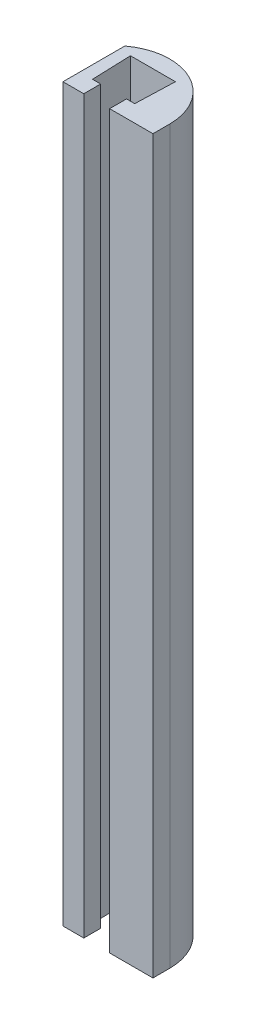
ISO-10303-21;
HEADER;
FILE_DESCRIPTION(('STEP AP214'),'2;1');
FILE_NAME('part.step','',(''),(''),'','','');
FILE_SCHEMA(('AUTOMOTIVE_DESIGN { 1 0 10303 214 1 1 1 1 }'));
ENDSEC;
DATA;
#1=APPLICATION_CONTEXT('core data for automotive mechanical design processes');
#2=APPLICATION_PROTOCOL_DEFINITION('international standard','automotive_design',2000,#1);
#3=PRODUCT_CONTEXT('',#1,'mechanical');
#4=PRODUCT('Part','Part','',(#3));
#5=PRODUCT_RELATED_PRODUCT_CATEGORY('part','',(#4));
#6=PRODUCT_DEFINITION_FORMATION('','',#4);
#7=PRODUCT_DEFINITION_CONTEXT('part definition',#1,'design');
#8=PRODUCT_DEFINITION('design','',#6,#7);
#9=PRODUCT_DEFINITION_SHAPE('','',#8);
#10=(LENGTH_UNIT() NAMED_UNIT(*) SI_UNIT(.MILLI.,.METRE.));
#11=(NAMED_UNIT(*) PLANE_ANGLE_UNIT() SI_UNIT($,.RADIAN.));
#12=(NAMED_UNIT(*) SI_UNIT($,.STERADIAN.) SOLID_ANGLE_UNIT());
#13=UNCERTAINTY_MEASURE_WITH_UNIT(LENGTH_MEASURE(1.E-05),#10,'distance_accuracy_value','');
#14=(GEOMETRIC_REPRESENTATION_CONTEXT(3) GLOBAL_UNCERTAINTY_ASSIGNED_CONTEXT((#13)) GLOBAL_UNIT_ASSIGNED_CONTEXT((#10,
#11,#12)) REPRESENTATION_CONTEXT('',''));
#15=CARTESIAN_POINT('',(0.,0.,0.));
#16=DIRECTION('',(0.,0.,1.));
#17=DIRECTION('',(1.,0.,0.));
#18=AXIS2_PLACEMENT_3D('',#15,#16,#17);
#19=CARTESIAN_POINT('',(0.,130.,-3.));
#20=DIRECTION('',(0.,-1.,0.));
#21=DIRECTION('',(0.,0.,-1.));
#22=AXIS2_PLACEMENT_3D('',#19,#20,#21);
#23=CYLINDRICAL_SURFACE('',#22,10.);
#24=CARTESIAN_POINT('',(0.,0.,-3.));
#25=DIRECTION('',(0.,1.,0.));
#26=DIRECTION('',(0.,0.,-1.));
#27=AXIS2_PLACEMENT_3D('',#24,#25,#26);
#28=CIRCLE('',#27,10.);
#29=CARTESIAN_POINT('',(10.,0.,-3.));
#30=VERTEX_POINT('',#29);
#31=CARTESIAN_POINT('',(-6.,0.,-11.));
#32=VERTEX_POINT('',#31);
#33=EDGE_CURVE('E163',#30,#32,#28,.T.);
#34=ORIENTED_EDGE('',*,*,#33,.T.);
#35=DIRECTION('',(0.,-1.,0.));
#36=VECTOR('',#35,1.);
#37=CARTESIAN_POINT('',(-6.,130.,-11.));
#38=LINE('',#37,#36);
#39=CARTESIAN_POINT('',(-6.,130.,-11.));
#40=VERTEX_POINT('',#39);
#41=EDGE_CURVE('E197',#40,#32,#38,.T.);
#42=ORIENTED_EDGE('',*,*,#41,.F.);
#43=CARTESIAN_POINT('',(0.,130.,-3.));
#44=DIRECTION('',(0.,1.,0.));
#45=DIRECTION('',(0.,0.,1.));
#46=AXIS2_PLACEMENT_3D('',#43,#44,#45);
#47=CIRCLE('',#46,10.);
#48=CARTESIAN_POINT('',(10.,130.,-3.));
#49=VERTEX_POINT('',#48);
#50=EDGE_CURVE('E226',#49,#40,#47,.T.);
#51=ORIENTED_EDGE('',*,*,#50,.F.);
#52=DIRECTION('',(0.,-1.,0.));
#53=VECTOR('',#52,1.);
#54=CARTESIAN_POINT('',(10.,130.,-3.));
#55=LINE('',#54,#53);
#56=EDGE_CURVE('E200',#49,#30,#55,.T.);
#57=ORIENTED_EDGE('',*,*,#56,.T.);
#58=EDGE_LOOP('',(#34,#42,#51,#57));
#59=FACE_BOUND('',#58,.T.);
#60=CARTESIAN_POINT('',(0.,10.25,-13.));
#61=CARTESIAN_POINT('',(-0.101518396192305,10.2499995931478,-13.0000003148877));
#62=CARTESIAN_POINT('',(-0.203030435693203,10.2541257705902,-12.9984506611724));
#63=CARTESIAN_POINT('',(-0.405326586162715,10.2705881656394,-12.9922947410159));
#64=CARTESIAN_POINT('',(-0.506110453997933,10.2829270079811,-12.9876874973824));
#65=CARTESIAN_POINT('',(-0.706124419877822,10.315688890499,-12.9755408643138));
#66=CARTESIAN_POINT('',(-0.805355315325653,10.3361076301856,-12.9680030347074));
#67=CARTESIAN_POINT('',(-1.00162576283666,10.3848251633169,-12.9502001825416));
#68=CARTESIAN_POINT('',(-1.09866444757431,10.4131270185872,-12.939934100392));
#69=CARTESIAN_POINT('',(-1.38503029440588,10.5093564477781,-12.9054755824967));
#70=CARTESIAN_POINT('',(-1.5702179144485,10.588709300538,-12.8775833893482));
#71=CARTESIAN_POINT('',(-1.92453093012071,10.7752730259327,-12.8147179131779));
#72=CARTESIAN_POINT('',(-2.09365200095869,10.8824913705457,-12.7797427314478));
#73=CARTESIAN_POINT('',(-2.41835679874341,11.1265293479933,-12.7046565368922));
#74=CARTESIAN_POINT('',(-2.5731743450747,11.2643251244624,-12.6644001618842));
#75=CARTESIAN_POINT('',(-2.85811301792009,11.5635266179955,-12.5840054244584));
#76=CARTESIAN_POINT('',(-2.98822658522002,11.7249395350443,-12.5438671018508));
#77=CARTESIAN_POINT('',(-3.22495435340075,12.0742935184669,-12.4665617929786));
#78=CARTESIAN_POINT('',(-3.3304846420933,12.2630108761455,-12.4295662278791));
#79=CARTESIAN_POINT('',(-3.50796634607769,12.6571209256243,-12.3649964985801));
#80=CARTESIAN_POINT('',(-3.57993117334566,12.8625069184467,-12.3374185724932));
#81=CARTESIAN_POINT('',(-3.68521072814697,13.2752918405197,-12.2963603224291));
#82=CARTESIAN_POINT('',(-3.71998981781697,13.4822625933885,-12.2823481091592));
#83=CARTESIAN_POINT('',(-3.75448892593294,13.8995403976836,-12.2684515361422));
#84=CARTESIAN_POINT('',(-3.75422342336961,14.1098460353624,-12.2685613417545));
#85=CARTESIAN_POINT('',(-3.71976073714327,14.5144238124091,-12.2824377905461));
#86=CARTESIAN_POINT('',(-3.68759521184218,14.7089022650539,-12.2953867204446));
#87=CARTESIAN_POINT('',(-3.59360419748527,15.0894678763057,-12.3321234500933));
#88=CARTESIAN_POINT('',(-3.5317742417939,15.2755537666093,-12.3559128820936));
#89=CARTESIAN_POINT('',(-3.37909371408551,15.6381926692342,-12.4121425551398));
#90=CARTESIAN_POINT('',(-3.28771621837055,15.8144987152801,-12.4447379498071));
#91=CARTESIAN_POINT('',(-3.07890184412442,16.1498643440006,-12.51485525338));
#92=CARTESIAN_POINT('',(-2.96145596823814,16.3089179438057,-12.5523788614005));
#93=CARTESIAN_POINT('',(-2.69454451914693,16.6165091591204,-12.6312009715082));
#94=CARTESIAN_POINT('',(-2.54345746791939,16.7636216018684,-12.6725836863999));
#95=CARTESIAN_POINT('',(-2.21828147705205,17.0308449155163,-12.752293204094));
#96=CARTESIAN_POINT('',(-2.04418900874462,17.1509516365147,-12.7906195366466));
#97=CARTESIAN_POINT('',(-1.67430859247982,17.3623259926558,-12.8606598702292));
#98=CARTESIAN_POINT('',(-1.47822678461148,17.4531189530525,-12.892262456491));
#99=CARTESIAN_POINT('',(-1.07209212631178,17.5999565106752,-12.9444679581735));
#100=CARTESIAN_POINT('',(-0.862045527114481,17.6560165414028,-12.9650757585372));
#101=CARTESIAN_POINT('',(-0.445938107871603,17.7290569688548,-12.9921110807018));
#102=CARTESIAN_POINT('',(-0.240259048905582,17.7479565159562,-12.9992342256422));
#103=CARTESIAN_POINT('',(0.171431188137619,17.7517276597498,-13.0006473425031));
#104=CARTESIAN_POINT('',(0.377442282458727,17.7366068007921,-12.9949401596715));
#105=CARTESIAN_POINT('',(0.775655121404365,17.6742248942282,-12.9717927443161));
#106=CARTESIAN_POINT('',(0.968083320017282,17.6282211406568,-12.9548117740578));
#107=CARTESIAN_POINT('',(1.34235438739411,17.5070348186322,-12.9112869272928));
#108=CARTESIAN_POINT('',(1.52419587587278,17.4318484551318,-12.8847418070502));
#109=CARTESIAN_POINT('',(1.87811941277132,17.2520339688993,-12.8237406101926));
#110=CARTESIAN_POINT('',(2.04975770887911,17.1466056769341,-12.7890750052357));
#111=CARTESIAN_POINT('',(2.37348177933194,16.9102047420785,-12.7156667891146));
#112=CARTESIAN_POINT('',(2.52556030073359,16.7792226686649,-12.6769226752304));
#113=CARTESIAN_POINT('',(2.81507699680056,16.4864896946599,-12.5968332372827));
#114=CARTESIAN_POINT('',(2.95115385285618,16.3233945429555,-12.5554674126238));
#115=CARTESIAN_POINT('',(3.19427625103064,15.9758715383436,-12.4769703936408));
#116=CARTESIAN_POINT('',(3.30131918623443,15.7914417719504,-12.4398395797458));
#117=CARTESIAN_POINT('',(3.48344433709986,15.4049600326458,-12.3741707456762));
#118=CARTESIAN_POINT('',(3.55839213290037,15.2028381336405,-12.345669008641));
#119=CARTESIAN_POINT('',(3.67269708994278,14.7874755923629,-12.3013508218467));
#120=CARTESIAN_POINT('',(3.71207626984255,14.5742419154097,-12.2855265248386));
#121=CARTESIAN_POINT('',(3.75215866602556,14.1574595956214,-12.2693973713104));
#122=CARTESIAN_POINT('',(3.75518324604508,13.9541684007001,-12.2681611185003));
#123=CARTESIAN_POINT('',(3.72841793238675,13.5501367293154,-12.278960313216));
#124=CARTESIAN_POINT('',(3.69863115021474,13.3493960128158,-12.2909945023041));
#125=CARTESIAN_POINT('',(3.60889524149326,12.9623818609874,-12.3262035591886));
#126=CARTESIAN_POINT('',(3.54989440883459,12.7758538687135,-12.3490272063437));
#127=CARTESIAN_POINT('',(3.40424296871538,12.4152364945042,-12.4030386355008));
#128=CARTESIAN_POINT('',(3.31758537143274,12.2411502706625,-12.4342285316256));
#129=CARTESIAN_POINT('',(3.11379974329922,11.9004319829787,-12.5034933799157));
#130=CARTESIAN_POINT('',(2.99531258181789,11.7346690218977,-12.5418435402028));
#131=CARTESIAN_POINT('',(2.73337038412728,11.4246500849433,-12.6201550894072));
#132=CARTESIAN_POINT('',(2.58990741255809,11.2804009716157,-12.6601169872989));
#133=CARTESIAN_POINT('',(2.27266851234862,11.009479395099,-12.7397648699462));
#134=CARTESIAN_POINT('',(2.0976723337802,10.884180484779,-12.7793189022729));
#135=CARTESIAN_POINT('',(1.82043095326466,10.7197353821215,-12.8333601549829));
#136=CARTESIAN_POINT('',(1.7254952234331,10.6688130456688,-12.8505013475998));
#137=CARTESIAN_POINT('',(1.5312993669715,10.5752052334941,-12.8825493292825));
#138=CARTESIAN_POINT('',(1.43204109937803,10.5325162588267,-12.8974570668994));
#139=CARTESIAN_POINT('',(1.22544652708578,10.4540835375359,-12.92520117632));
#140=CARTESIAN_POINT('',(1.11794690479036,10.4187272364551,-12.9379177964972));
#141=CARTESIAN_POINT('',(0.899916442865954,10.3578229288076,-12.9600275124024));
#142=CARTESIAN_POINT('',(0.789386953961826,10.3322706253938,-12.9694220639682));
#143=CARTESIAN_POINT('',(0.56624360569349,10.2912623484285,-12.9845816899313));
#144=CARTESIAN_POINT('',(0.453630117900994,10.2758045925444,-12.9903474050436));
#145=CARTESIAN_POINT('',(0.22734168292238,10.2551742261257,-12.9980561682157));
#146=CARTESIAN_POINT('',(0.113666856910657,10.2500004555392,-12.9999996474305));
#147=CARTESIAN_POINT('',(0.,10.25,-13.));
#148=B_SPLINE_CURVE_WITH_KNOTS('',3,(#60,#61,#62,#63,#64,#65,#66,#67,#68,#69,#70,#71,#72,#73,
#74,#75,#76,#77,#78,#79,#80,#81,#82,#83,#84,#85,#86,#87,#88,#89,#90,#91,#92,#93,#94,#95,#96,#97,
#98,#99,#100,#101,#102,#103,#104,#105,#106,#107,#108,#109,#110,#111,#112,#113,#114,#115,#116,
#117,#118,#119,#120,#121,#122,#123,#124,#125,#126,#127,#128,#129,#130,#131,#132,#133,#134,#135,
#136,#137,#138,#139,#140,#141,#142,#143,#144,#145,#146,#147),.UNSPECIFIED.,.T.,.F.,(4,2,2,2,2,2,
2,2,2,2,2,2,2,2,2,2,2,2,2,2,2,2,2,2,2,2,2,2,2,2,2,2,2,2,2,2,2,2,2,2,2,2,2,4),(0.,
0.304448353706217,0.60899405463877,0.913377880020562,1.21788009423816,1.82504714344594,
2.43237716943574,3.0629591849799,3.69373384355255,4.34853558295347,5.00307545421535,
5.63076558083454,6.25819637240469,6.8480773484487,7.43804717199766,8.03917893015839,
8.6405184890894,9.28227255387826,9.92412516810958,10.5759031026348,11.2273912129541,
11.8442442113811,12.4609604302459,13.0539796685789,13.6470760518443,14.2575992669729,
14.8683482209796,15.5145317068744,16.1607731934865,16.809695388663,17.4582155943956,
18.0650878074892,18.6719024757644,19.2601972811463,19.8486408868956,20.4679305175897,
21.0874172704095,21.7404269618339,22.0673415343729,22.3941168698762,22.7352461802417,
23.0762258109096,23.4171452206013,23.7580261717922),.UNSPECIFIED.);
#149=CARTESIAN_POINT('',(0.,10.25,-13.));
#150=VERTEX_POINT('',#149);
#151=EDGE_CURVE('E158',#150,#150,#148,.T.);
#152=ORIENTED_EDGE('',*,*,#151,.F.);
#153=EDGE_LOOP('',(#152));
#154=FACE_BOUND('',#153,.T.);
#155=ADVANCED_FACE('F34',(#59,#154),#23,.T.);
#156=CARTESIAN_POINT('',(2.3,130.,-3.));
#157=DIRECTION('',(1.,0.,0.));
#158=DIRECTION('',(0.,0.,-1.));
#159=AXIS2_PLACEMENT_3D('',#156,#157,#158);
#160=PLANE('',#159);
#161=DIRECTION('',(0.,0.,1.));
#162=VECTOR('',#161,1.);
#163=CARTESIAN_POINT('',(2.3,0.,-3.));
#164=LINE('',#163,#162);
#165=CARTESIAN_POINT('',(2.3,0.,-3.));
#166=VERTEX_POINT('',#165);
#167=CARTESIAN_POINT('',(2.3,0.,0.));
#168=VERTEX_POINT('',#167);
#169=EDGE_CURVE('E155',#166,#168,#164,.T.);
#170=ORIENTED_EDGE('',*,*,#169,.T.);
#171=DIRECTION('',(0.,-1.,0.));
#172=VECTOR('',#171,1.);
#173=CARTESIAN_POINT('',(2.3,130.,0.));
#174=LINE('',#173,#172);
#175=CARTESIAN_POINT('',(2.3,130.,0.));
#176=VERTEX_POINT('',#175);
#177=EDGE_CURVE('E11',#176,#168,#174,.T.);
#178=ORIENTED_EDGE('',*,*,#177,.F.);
#179=DIRECTION('',(0.,0.,1.));
#180=VECTOR('',#179,1.);
#181=CARTESIAN_POINT('',(2.3,130.,-3.));
#182=LINE('',#181,#180);
#183=CARTESIAN_POINT('',(2.3,130.,-3.));
#184=VERTEX_POINT('',#183);
#185=EDGE_CURVE('E182',#184,#176,#182,.T.);
#186=ORIENTED_EDGE('',*,*,#185,.F.);
#187=DIRECTION('',(0.,-1.,0.));
#188=VECTOR('',#187,1.);
#189=CARTESIAN_POINT('',(2.3,130.,-3.));
#190=LINE('',#189,#188);
#191=EDGE_CURVE('E98',#184,#166,#190,.T.);
#192=ORIENTED_EDGE('',*,*,#191,.T.);
#193=EDGE_LOOP('',(#170,#178,#186,#192));
#194=FACE_BOUND('',#193,.T.);
#195=ADVANCED_FACE('F36',(#194),#160,.F.);
#196=CARTESIAN_POINT('',(2.3,130.,0.));
#197=DIRECTION('',(0.,0.,-1.));
#198=DIRECTION('',(-1.,0.,0.));
#199=AXIS2_PLACEMENT_3D('',#196,#197,#198);
#200=PLANE('',#199);
#201=DIRECTION('',(1.,0.,0.));
#202=VECTOR('',#201,1.);
#203=CARTESIAN_POINT('',(2.3,0.,0.));
#204=LINE('',#203,#202);
#205=CARTESIAN_POINT('',(10.,0.,0.));
#206=VERTEX_POINT('',#205);
#207=EDGE_CURVE('E157',#168,#206,#204,.T.);
#208=ORIENTED_EDGE('',*,*,#207,.T.);
#209=DIRECTION('',(0.,-1.,0.));
#210=VECTOR('',#209,1.);
#211=CARTESIAN_POINT('',(10.,130.,0.));
#212=LINE('',#211,#210);
#213=CARTESIAN_POINT('',(10.,130.,0.));
#214=VERTEX_POINT('',#213);
#215=EDGE_CURVE('E43',#214,#206,#212,.T.);
#216=ORIENTED_EDGE('',*,*,#215,.F.);
#217=DIRECTION('',(1.,0.,0.));
#218=VECTOR('',#217,1.);
#219=CARTESIAN_POINT('',(2.3,130.,0.));
#220=LINE('',#219,#218);
#221=EDGE_CURVE('E105',#176,#214,#220,.T.);
#222=ORIENTED_EDGE('',*,*,#221,.F.);
#223=ORIENTED_EDGE('',*,*,#177,.T.);
#224=EDGE_LOOP('',(#208,#216,#222,#223));
#225=FACE_BOUND('',#224,.T.);
#226=ADVANCED_FACE('F293',(#225),#200,.F.);
#227=CARTESIAN_POINT('',(10.,130.,0.));
#228=DIRECTION('',(-1.,0.,0.));
#229=DIRECTION('',(0.,0.,1.));
#230=AXIS2_PLACEMENT_3D('',#227,#228,#229);
#231=PLANE('',#230);
#232=DIRECTION('',(0.,0.,-1.));
#233=VECTOR('',#232,1.);
#234=CARTESIAN_POINT('',(10.,0.,0.));
#235=LINE('',#234,#233);
#236=EDGE_CURVE('E160',#206,#30,#235,.T.);
#237=ORIENTED_EDGE('',*,*,#236,.T.);
#238=ORIENTED_EDGE('',*,*,#56,.F.);
#239=DIRECTION('',(0.,0.,-1.));
#240=VECTOR('',#239,1.);
#241=CARTESIAN_POINT('',(10.,130.,0.));
#242=LINE('',#241,#240);
#243=EDGE_CURVE('E209',#214,#49,#242,.T.);
#244=ORIENTED_EDGE('',*,*,#243,.F.);
#245=ORIENTED_EDGE('',*,*,#215,.T.);
#246=EDGE_LOOP('',(#237,#238,#244,#245));
#247=FACE_BOUND('',#246,.T.);
#248=ADVANCED_FACE('F207',(#247),#231,.F.);
#249=CARTESIAN_POINT('',(-6.,130.,0.));
#250=DIRECTION('',(1.,0.,0.));
#251=DIRECTION('',(0.,0.,-1.));
#252=AXIS2_PLACEMENT_3D('',#249,#250,#251);
#253=PLANE('',#252);
#254=DIRECTION('',(0.,0.,1.));
#255=VECTOR('',#254,1.);
#256=CARTESIAN_POINT('',(-6.,0.,0.));
#257=LINE('',#256,#255);
#258=CARTESIAN_POINT('',(-6.,0.,0.));
#259=VERTEX_POINT('',#258);
#260=EDGE_CURVE('E165',#32,#259,#257,.T.);
#261=ORIENTED_EDGE('',*,*,#260,.T.);
#262=DIRECTION('',(0.,-1.,0.));
#263=VECTOR('',#262,1.);
#264=CARTESIAN_POINT('',(-6.,130.,0.));
#265=LINE('',#264,#263);
#266=CARTESIAN_POINT('',(-6.,130.,0.));
#267=VERTEX_POINT('',#266);
#268=EDGE_CURVE('E194',#267,#259,#265,.T.);
#269=ORIENTED_EDGE('',*,*,#268,.F.);
#270=DIRECTION('',(0.,0.,1.));
#271=VECTOR('',#270,1.);
#272=CARTESIAN_POINT('',(-6.,130.,0.));
#273=LINE('',#272,#271);
#274=EDGE_CURVE('E223',#40,#267,#273,.T.);
#275=ORIENTED_EDGE('',*,*,#274,.F.);
#276=ORIENTED_EDGE('',*,*,#41,.T.);
#277=EDGE_LOOP('',(#261,#269,#275,#276));
#278=FACE_BOUND('',#277,.T.);
#279=ADVANCED_FACE('F221',(#278),#253,.F.);
#280=CARTESIAN_POINT('',(-2.3,130.,0.));
#281=DIRECTION('',(0.,0.,-1.));
#282=DIRECTION('',(-1.,0.,0.));
#283=AXIS2_PLACEMENT_3D('',#280,#281,#282);
#284=PLANE('',#283);
#285=DIRECTION('',(1.,0.,0.));
#286=VECTOR('',#285,1.);
#287=CARTESIAN_POINT('',(-2.3,0.,0.));
#288=LINE('',#287,#286);
#289=CARTESIAN_POINT('',(-2.3,0.,0.));
#290=VERTEX_POINT('',#289);
#291=EDGE_CURVE('E167',#259,#290,#288,.T.);
#292=ORIENTED_EDGE('',*,*,#291,.T.);
#293=DIRECTION('',(0.,-1.,0.));
#294=VECTOR('',#293,1.);
#295=CARTESIAN_POINT('',(-2.3,130.,0.));
#296=LINE('',#295,#294);
#297=CARTESIAN_POINT('',(-2.3,130.,0.));
#298=VERTEX_POINT('',#297);
#299=EDGE_CURVE('E191',#298,#290,#296,.T.);
#300=ORIENTED_EDGE('',*,*,#299,.F.);
#301=DIRECTION('',(1.,0.,0.));
#302=VECTOR('',#301,1.);
#303=CARTESIAN_POINT('',(-2.3,130.,0.));
#304=LINE('',#303,#302);
#305=EDGE_CURVE('E225',#267,#298,#304,.T.);
#306=ORIENTED_EDGE('',*,*,#305,.F.);
#307=ORIENTED_EDGE('',*,*,#268,.T.);
#308=EDGE_LOOP('',(#292,#300,#306,#307));
#309=FACE_BOUND('',#308,.T.);
#310=ADVANCED_FACE('F285',(#309),#284,.F.);
#311=CARTESIAN_POINT('',(-2.3,130.,-3.));
#312=DIRECTION('',(-1.,0.,0.));
#313=DIRECTION('',(0.,0.,1.));
#314=AXIS2_PLACEMENT_3D('',#311,#312,#313);
#315=PLANE('',#314);
#316=DIRECTION('',(0.,0.,-1.));
#317=VECTOR('',#316,1.);
#318=CARTESIAN_POINT('',(-2.3,0.,-3.));
#319=LINE('',#318,#317);
#320=CARTESIAN_POINT('',(-2.3,0.,-3.));
#321=VERTEX_POINT('',#320);
#322=EDGE_CURVE('E169',#290,#321,#319,.T.);
#323=ORIENTED_EDGE('',*,*,#322,.T.);
#324=DIRECTION('',(0.,-1.,0.));
#325=VECTOR('',#324,1.);
#326=CARTESIAN_POINT('',(-2.3,130.,-3.));
#327=LINE('',#326,#325);
#328=CARTESIAN_POINT('',(-2.3,130.,-3.));
#329=VERTEX_POINT('',#328);
#330=EDGE_CURVE('E189',#329,#321,#327,.T.);
#331=ORIENTED_EDGE('',*,*,#330,.F.);
#332=DIRECTION('',(0.,0.,-1.));
#333=VECTOR('',#332,1.);
#334=CARTESIAN_POINT('',(-2.3,130.,-3.));
#335=LINE('',#334,#333);
#336=EDGE_CURVE('E228',#298,#329,#335,.T.);
#337=ORIENTED_EDGE('',*,*,#336,.F.);
#338=ORIENTED_EDGE('',*,*,#299,.T.);
#339=EDGE_LOOP('',(#323,#331,#337,#338));
#340=FACE_BOUND('',#339,.T.);
#341=ADVANCED_FACE('F282',(#340),#315,.F.);
#342=CARTESIAN_POINT('',(-3.75,130.,-3.));
#343=DIRECTION('',(0.,0.,1.));
#344=DIRECTION('',(1.,0.,0.));
#345=AXIS2_PLACEMENT_3D('',#342,#343,#344);
#346=PLANE('',#345);
#347=ORIENTED_EDGE('',*,*,#330,.T.);
#348=DIRECTION('',(-1.,0.,0.));
#349=VECTOR('',#348,1.);
#350=CARTESIAN_POINT('',(-3.75,0.,-3.));
#351=LINE('',#350,#349);
#352=CARTESIAN_POINT('',(-3.75,0.,-3.));
#353=VERTEX_POINT('',#352);
#354=EDGE_CURVE('E172',#321,#353,#351,.T.);
#355=ORIENTED_EDGE('',*,*,#354,.T.);
#356=DIRECTION('',(0.,-1.,0.));
#357=VECTOR('',#356,1.);
#358=CARTESIAN_POINT('',(-3.75,130.,-3.));
#359=LINE('',#358,#357);
#360=CARTESIAN_POINT('',(-3.75,130.,-3.));
#361=VERTEX_POINT('',#360);
#362=EDGE_CURVE('E186',#361,#353,#359,.T.);
#363=ORIENTED_EDGE('',*,*,#362,.F.);
#364=DIRECTION('',(-1.,0.,0.));
#365=VECTOR('',#364,1.);
#366=CARTESIAN_POINT('',(-3.75,130.,-3.));
#367=LINE('',#366,#365);
#368=EDGE_CURVE('E234',#329,#361,#367,.T.);
#369=ORIENTED_EDGE('',*,*,#368,.F.);
#370=EDGE_LOOP('',(#347,#355,#363,#369));
#371=FACE_BOUND('',#370,.T.);
#372=ADVANCED_FACE('F240',(#371),#346,.F.);
#373=CARTESIAN_POINT('',(-3.75,130.,-3.));
#374=DIRECTION('',(-0.999362854347549,0.,0.0356915305124125));
#375=DIRECTION('',(0.0356915305124125,0.,0.99936285434755));
#376=AXIS2_PLACEMENT_3D('',#373,#374,#375);
#377=PLANE('',#376);
#378=DIRECTION('',(-0.0356915305124125,0.,-0.999362854347549));
#379=VECTOR('',#378,1.);
#380=CARTESIAN_POINT('',(-3.75,0.,-3.));
#381=LINE('',#380,#379);
#382=CARTESIAN_POINT('',(-4.,0.,-10.));
#383=VERTEX_POINT('',#382);
#384=EDGE_CURVE('E175',#353,#383,#381,.T.);
#385=ORIENTED_EDGE('',*,*,#384,.T.);
#386=DIRECTION('',(0.,-1.,0.));
#387=VECTOR('',#386,1.);
#388=CARTESIAN_POINT('',(-4.,130.,-10.));
#389=LINE('',#388,#387);
#390=CARTESIAN_POINT('',(-4.,130.,-10.));
#391=VERTEX_POINT('',#390);
#392=EDGE_CURVE('E148',#391,#383,#389,.T.);
#393=ORIENTED_EDGE('',*,*,#392,.F.);
#394=DIRECTION('',(-0.0356915305124125,0.,-0.999362854347549));
#395=VECTOR('',#394,1.);
#396=CARTESIAN_POINT('',(-3.75,130.,-3.));
#397=LINE('',#396,#395);
#398=EDGE_CURVE('E136',#361,#391,#397,.T.);
#399=ORIENTED_EDGE('',*,*,#398,.F.);
#400=ORIENTED_EDGE('',*,*,#362,.T.);
#401=EDGE_LOOP('',(#385,#393,#399,#400));
#402=FACE_BOUND('',#401,.T.);
#403=ADVANCED_FACE('F244',(#402),#377,.F.);
#404=CARTESIAN_POINT('',(4.,130.,-10.));
#405=DIRECTION('',(0.,0.,-1.));
#406=DIRECTION('',(-1.,0.,0.));
#407=AXIS2_PLACEMENT_3D('',#404,#405,#406);
#408=PLANE('',#407);
#409=CARTESIAN_POINT('',(0.,14.,-10.));
#410=DIRECTION('',(0.,0.,-1.));
#411=DIRECTION('',(-1.,0.,0.));
#412=AXIS2_PLACEMENT_3D('',#409,#410,#411);
#413=CIRCLE('',#412,3.75);
#414=CARTESIAN_POINT('',(-3.75,14.,-10.));
#415=VERTEX_POINT('',#414);
#416=EDGE_CURVE('E258',#415,#415,#413,.F.);
#417=ORIENTED_EDGE('',*,*,#416,.F.);
#418=EDGE_LOOP('',(#417));
#419=FACE_BOUND('',#418,.T.);
#420=DIRECTION('',(1.,0.,0.));
#421=VECTOR('',#420,1.);
#422=CARTESIAN_POINT('',(4.,0.,-10.));
#423=LINE('',#422,#421);
#424=CARTESIAN_POINT('',(4.,0.,-10.));
#425=VERTEX_POINT('',#424);
#426=EDGE_CURVE('E145',#383,#425,#423,.T.);
#427=ORIENTED_EDGE('',*,*,#426,.T.);
#428=DIRECTION('',(0.,-1.,0.));
#429=VECTOR('',#428,1.);
#430=CARTESIAN_POINT('',(4.,130.,-10.));
#431=LINE('',#430,#429);
#432=CARTESIAN_POINT('',(4.,130.,-10.));
#433=VERTEX_POINT('',#432);
#434=EDGE_CURVE('E142',#433,#425,#431,.T.);
#435=ORIENTED_EDGE('',*,*,#434,.F.);
#436=DIRECTION('',(1.,0.,0.));
#437=VECTOR('',#436,1.);
#438=CARTESIAN_POINT('',(4.,130.,-10.));
#439=LINE('',#438,#437);
#440=EDGE_CURVE('E130',#391,#433,#439,.T.);
#441=ORIENTED_EDGE('',*,*,#440,.F.);
#442=ORIENTED_EDGE('',*,*,#392,.T.);
#443=EDGE_LOOP('',(#427,#435,#441,#442));
#444=FACE_BOUND('',#443,.T.);
#445=ADVANCED_FACE('F143',(#419,#444),#408,.F.);
#446=CARTESIAN_POINT('',(3.75,130.,-3.));
#447=DIRECTION('',(0.999362854347549,0.,0.0356915305124125));
#448=DIRECTION('',(0.0356915305124125,0.,-0.99936285434755));
#449=AXIS2_PLACEMENT_3D('',#446,#447,#448);
#450=PLANE('',#449);
#451=DIRECTION('',(-0.0356915305124125,0.,0.999362854347549));
#452=VECTOR('',#451,1.);
#453=CARTESIAN_POINT('',(3.75,0.,-3.));
#454=LINE('',#453,#452);
#455=CARTESIAN_POINT('',(3.75,0.,-3.));
#456=VERTEX_POINT('',#455);
#457=EDGE_CURVE('E178',#425,#456,#454,.T.);
#458=ORIENTED_EDGE('',*,*,#457,.T.);
#459=DIRECTION('',(0.,-1.,0.));
#460=VECTOR('',#459,1.);
#461=CARTESIAN_POINT('',(3.75,130.,-3.));
#462=LINE('',#461,#460);
#463=CARTESIAN_POINT('',(3.75,130.,-3.));
#464=VERTEX_POINT('',#463);
#465=EDGE_CURVE('E91',#464,#456,#462,.T.);
#466=ORIENTED_EDGE('',*,*,#465,.F.);
#467=DIRECTION('',(-0.0356915305124125,0.,0.999362854347549));
#468=VECTOR('',#467,1.);
#469=CARTESIAN_POINT('',(3.75,130.,-3.));
#470=LINE('',#469,#468);
#471=EDGE_CURVE('E134',#433,#464,#470,.T.);
#472=ORIENTED_EDGE('',*,*,#471,.F.);
#473=ORIENTED_EDGE('',*,*,#434,.T.);
#474=EDGE_LOOP('',(#458,#466,#472,#473));
#475=FACE_BOUND('',#474,.T.);
#476=ADVANCED_FACE('F150',(#475),#450,.F.);
#477=CARTESIAN_POINT('',(3.75,130.,-3.));
#478=DIRECTION('',(0.,0.,1.));
#479=DIRECTION('',(1.,0.,0.));
#480=AXIS2_PLACEMENT_3D('',#477,#478,#479);
#481=PLANE('',#480);
#482=ORIENTED_EDGE('',*,*,#465,.T.);
#483=DIRECTION('',(-1.,0.,0.));
#484=VECTOR('',#483,1.);
#485=CARTESIAN_POINT('',(3.75,0.,-3.));
#486=LINE('',#485,#484);
#487=EDGE_CURVE('E180',#456,#166,#486,.T.);
#488=ORIENTED_EDGE('',*,*,#487,.T.);
#489=ORIENTED_EDGE('',*,*,#191,.F.);
#490=DIRECTION('',(-1.,0.,0.));
#491=VECTOR('',#490,1.);
#492=CARTESIAN_POINT('',(3.75,130.,-3.));
#493=LINE('',#492,#491);
#494=EDGE_CURVE('E51',#464,#184,#493,.T.);
#495=ORIENTED_EDGE('',*,*,#494,.F.);
#496=EDGE_LOOP('',(#482,#488,#489,#495));
#497=FACE_BOUND('',#496,.T.);
#498=ADVANCED_FACE('F246',(#497),#481,.F.);
#499=CARTESIAN_POINT('',(0.,130.,-3.));
#500=DIRECTION('',(0.,1.,0.));
#501=DIRECTION('',(0.,0.,1.));
#502=AXIS2_PLACEMENT_3D('',#499,#500,#501);
#503=PLANE('',#502);
#504=ORIENTED_EDGE('',*,*,#185,.T.);
#505=ORIENTED_EDGE('',*,*,#221,.T.);
#506=ORIENTED_EDGE('',*,*,#243,.T.);
#507=ORIENTED_EDGE('',*,*,#50,.T.);
#508=ORIENTED_EDGE('',*,*,#274,.T.);
#509=ORIENTED_EDGE('',*,*,#305,.T.);
#510=ORIENTED_EDGE('',*,*,#336,.T.);
#511=ORIENTED_EDGE('',*,*,#368,.T.);
#512=ORIENTED_EDGE('',*,*,#398,.T.);
#513=ORIENTED_EDGE('',*,*,#440,.T.);
#514=ORIENTED_EDGE('',*,*,#471,.T.);
#515=ORIENTED_EDGE('',*,*,#494,.T.);
#516=EDGE_LOOP('',(#504,#505,#506,#507,#508,#509,#510,#511,#512,#513,#514,#515));
#517=FACE_BOUND('',#516,.T.);
#518=ADVANCED_FACE('F132',(#517),#503,.T.);
#519=CARTESIAN_POINT('',(0.,0.,-3.));
#520=DIRECTION('',(0.,1.,0.));
#521=DIRECTION('',(0.,0.,1.));
#522=AXIS2_PLACEMENT_3D('',#519,#520,#521);
#523=PLANE('',#522);
#524=ORIENTED_EDGE('',*,*,#169,.F.);
#525=ORIENTED_EDGE('',*,*,#487,.F.);
#526=ORIENTED_EDGE('',*,*,#457,.F.);
#527=ORIENTED_EDGE('',*,*,#426,.F.);
#528=ORIENTED_EDGE('',*,*,#384,.F.);
#529=ORIENTED_EDGE('',*,*,#354,.F.);
#530=ORIENTED_EDGE('',*,*,#322,.F.);
#531=ORIENTED_EDGE('',*,*,#291,.F.);
#532=ORIENTED_EDGE('',*,*,#260,.F.);
#533=ORIENTED_EDGE('',*,*,#33,.F.);
#534=ORIENTED_EDGE('',*,*,#236,.F.);
#535=ORIENTED_EDGE('',*,*,#207,.F.);
#536=EDGE_LOOP('',(#524,#525,#526,#527,#528,#529,#530,#531,#532,#533,#534,#535));
#537=FACE_BOUND('',#536,.T.);
#538=ADVANCED_FACE('F212',(#537),#523,.F.);
#539=CARTESIAN_POINT('',(0.,14.,-13.));
#540=DIRECTION('',(0.,0.,1.));
#541=DIRECTION('',(1.,0.,0.));
#542=AXIS2_PLACEMENT_3D('',#539,#540,#541);
#543=CYLINDRICAL_SURFACE('',#542,3.75);
#544=ORIENTED_EDGE('',*,*,#416,.T.);
#545=EDGE_LOOP('',(#544));
#546=FACE_BOUND('',#545,.T.);
#547=ORIENTED_EDGE('',*,*,#151,.T.);
#548=EDGE_LOOP('',(#547));
#549=FACE_BOUND('',#548,.T.);
#550=ADVANCED_FACE('F262',(#546,#549),#543,.F.);
#551=CLOSED_SHELL('',(#155,#195,#226,#248,#279,#310,#341,#372,#403,#445,#476,#498,#518,#538,#550));
#552=MANIFOLD_SOLID_BREP('B2',#551);
#553=ADVANCED_BREP_SHAPE_REPRESENTATION('',(#18,#552),#14);
#554=SHAPE_DEFINITION_REPRESENTATION(#9,#553);
ENDSEC;
END-ISO-10303-21;
